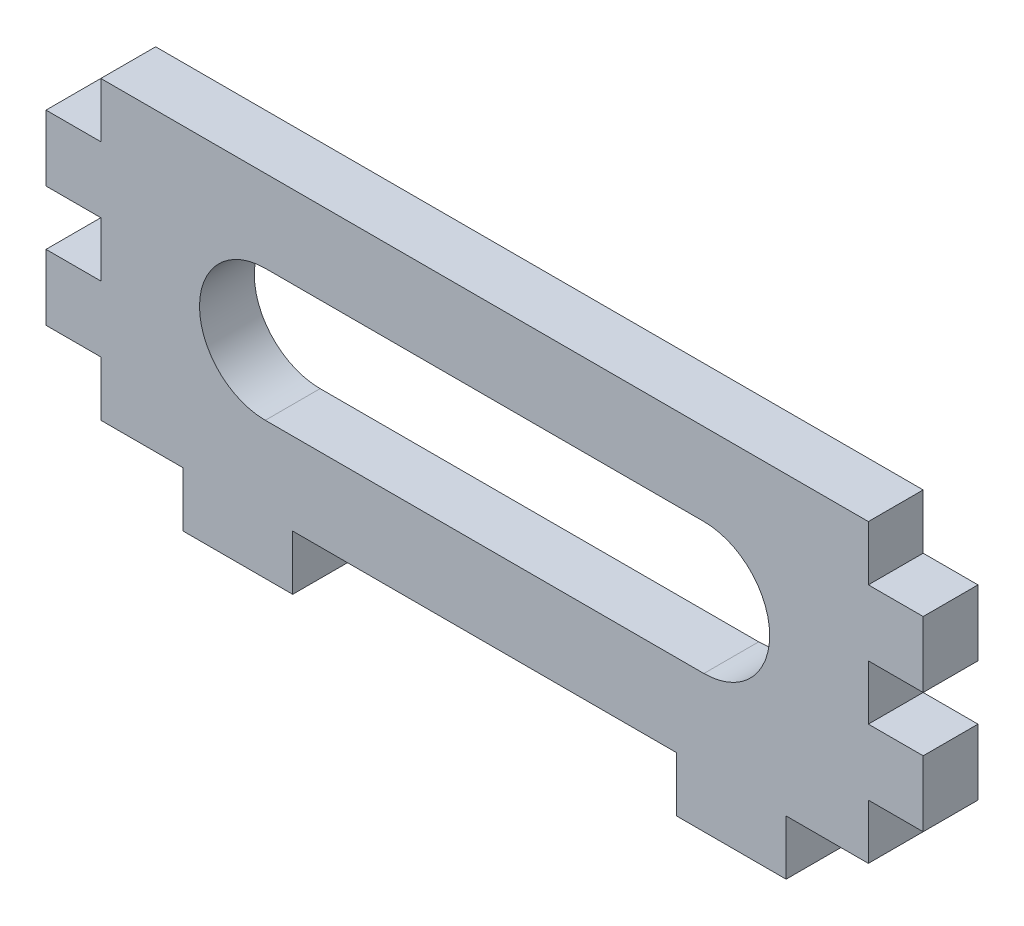
ISO-10303-21;
HEADER;
FILE_DESCRIPTION(('STEP AP214'),'2;1');
FILE_NAME('part.step','',(''),(''),'','','');
FILE_SCHEMA(('AUTOMOTIVE_DESIGN { 1 0 10303 214 1 1 1 1 }'));
ENDSEC;
DATA;
#1=APPLICATION_CONTEXT('core data for automotive mechanical design processes');
#2=APPLICATION_PROTOCOL_DEFINITION('international standard','automotive_design',2000,#1);
#3=PRODUCT_CONTEXT('',#1,'mechanical');
#4=PRODUCT('Part','Part','',(#3));
#5=PRODUCT_RELATED_PRODUCT_CATEGORY('part','',(#4));
#6=PRODUCT_DEFINITION_FORMATION('','',#4);
#7=PRODUCT_DEFINITION_CONTEXT('part definition',#1,'design');
#8=PRODUCT_DEFINITION('design','',#6,#7);
#9=PRODUCT_DEFINITION_SHAPE('','',#8);
#10=(LENGTH_UNIT() NAMED_UNIT(*) SI_UNIT(.MILLI.,.METRE.));
#11=(NAMED_UNIT(*) PLANE_ANGLE_UNIT() SI_UNIT($,.RADIAN.));
#12=(NAMED_UNIT(*) SI_UNIT($,.STERADIAN.) SOLID_ANGLE_UNIT());
#13=UNCERTAINTY_MEASURE_WITH_UNIT(LENGTH_MEASURE(1.E-05),#10,'distance_accuracy_value','');
#14=(GEOMETRIC_REPRESENTATION_CONTEXT(3) GLOBAL_UNCERTAINTY_ASSIGNED_CONTEXT((#13)) GLOBAL_UNIT_ASSIGNED_CONTEXT((#10,
#11,#12)) REPRESENTATION_CONTEXT('',''));
#15=CARTESIAN_POINT('',(0.,0.,0.));
#16=DIRECTION('',(0.,0.,1.));
#17=DIRECTION('',(1.,0.,0.));
#18=AXIS2_PLACEMENT_3D('',#15,#16,#17);
#19=CARTESIAN_POINT('',(-201.174614020416,143.421111622309,-5.));
#20=DIRECTION('',(0.,-1.,0.));
#21=DIRECTION('',(0.,0.,-1.));
#22=AXIS2_PLACEMENT_3D('',#19,#20,#21);
#23=PLANE('',#22);
#24=DIRECTION('',(0.,0.,1.));
#25=VECTOR('',#24,1.);
#26=CARTESIAN_POINT('',(-133.674614020416,143.421111622309,-5.));
#27=LINE('',#26,#25);
#28=CARTESIAN_POINT('',(-133.674614020416,143.421111622309,-5.));
#29=VERTEX_POINT('',#28);
#30=CARTESIAN_POINT('',(-133.674614020416,143.421111622309,0.));
#31=VERTEX_POINT('',#30);
#32=EDGE_CURVE('E520',#29,#31,#27,.T.);
#33=ORIENTED_EDGE('',*,*,#32,.F.);
#34=DIRECTION('',(1.,0.,0.));
#35=VECTOR('',#34,1.);
#36=CARTESIAN_POINT('',(-201.174614020416,143.421111622309,-5.));
#37=LINE('',#36,#35);
#38=CARTESIAN_POINT('',(-126.174614020416,143.421111622309,-5.));
#39=VERTEX_POINT('',#38);
#40=EDGE_CURVE('E37',#29,#39,#37,.T.);
#41=ORIENTED_EDGE('',*,*,#40,.T.);
#42=DIRECTION('',(0.,0.,1.));
#43=VECTOR('',#42,1.);
#44=CARTESIAN_POINT('',(-126.174614020416,143.421111622309,-5.));
#45=LINE('',#44,#43);
#46=CARTESIAN_POINT('',(-126.174614020416,143.421111622309,0.));
#47=VERTEX_POINT('',#46);
#48=EDGE_CURVE('E457',#39,#47,#45,.T.);
#49=ORIENTED_EDGE('',*,*,#48,.T.);
#50=DIRECTION('',(1.,0.,0.));
#51=VECTOR('',#50,1.);
#52=CARTESIAN_POINT('',(-201.174614020416,143.421111622309,0.));
#53=LINE('',#52,#51);
#54=EDGE_CURVE('E293',#31,#47,#53,.T.);
#55=ORIENTED_EDGE('',*,*,#54,.F.);
#56=EDGE_LOOP('',(#33,#41,#49,#55));
#57=FACE_BOUND('',#56,.T.);
#58=ADVANCED_FACE('F33',(#57),#23,.T.);
#59=CARTESIAN_POINT('',(-196.174614020416,143.421111622309,-5.));
#60=VERTEX_POINT('',#59);
#61=CARTESIAN_POINT('',(-188.674614020416,143.421111622309,-5.));
#62=VERTEX_POINT('',#61);
#63=EDGE_CURVE('E273',#60,#62,#37,.T.);
#64=ORIENTED_EDGE('',*,*,#63,.T.);
#65=DIRECTION('',(0.,0.,1.));
#66=VECTOR('',#65,1.);
#67=CARTESIAN_POINT('',(-188.674614020416,143.421111622309,-5.));
#68=LINE('',#67,#66);
#69=CARTESIAN_POINT('',(-188.674614020416,143.421111622309,0.));
#70=VERTEX_POINT('',#69);
#71=EDGE_CURVE('E318',#62,#70,#68,.T.);
#72=ORIENTED_EDGE('',*,*,#71,.T.);
#73=CARTESIAN_POINT('',(-196.174614020416,143.421111622309,0.));
#74=VERTEX_POINT('',#73);
#75=EDGE_CURVE('E281',#74,#70,#53,.T.);
#76=ORIENTED_EDGE('',*,*,#75,.F.);
#77=DIRECTION('',(0.,0.,1.));
#78=VECTOR('',#77,1.);
#79=CARTESIAN_POINT('',(-196.174614020416,143.421111622309,-5.));
#80=LINE('',#79,#78);
#81=EDGE_CURVE('E386',#60,#74,#80,.T.);
#82=ORIENTED_EDGE('',*,*,#81,.F.);
#83=EDGE_LOOP('',(#64,#72,#76,#82));
#84=FACE_BOUND('',#83,.T.);
#85=ADVANCED_FACE('F527',(#84),#23,.T.);
#86=CARTESIAN_POINT('',(-201.174614020416,170.421111622309,-5.));
#87=DIRECTION('',(-1.,0.,0.));
#88=DIRECTION('',(0.,0.,1.));
#89=AXIS2_PLACEMENT_3D('',#86,#87,#88);
#90=PLANE('',#89);
#91=DIRECTION('',(0.,0.,1.));
#92=VECTOR('',#91,1.);
#93=CARTESIAN_POINT('',(-201.174614020416,165.421111622309,-5.));
#94=LINE('',#93,#92);
#95=CARTESIAN_POINT('',(-201.174614020416,165.421111622309,-5.));
#96=VERTEX_POINT('',#95);
#97=CARTESIAN_POINT('',(-201.174614020416,165.421111622309,0.));
#98=VERTEX_POINT('',#97);
#99=EDGE_CURVE('E368',#96,#98,#94,.T.);
#100=ORIENTED_EDGE('',*,*,#99,.F.);
#101=DIRECTION('',(0.,-1.,0.));
#102=VECTOR('',#101,1.);
#103=CARTESIAN_POINT('',(-201.174614020416,170.421111622309,-5.));
#104=LINE('',#103,#102);
#105=CARTESIAN_POINT('',(-201.174614020416,159.421111622309,-5.));
#106=VERTEX_POINT('',#105);
#107=EDGE_CURVE('E278',#96,#106,#104,.T.);
#108=ORIENTED_EDGE('',*,*,#107,.T.);
#109=DIRECTION('',(0.,0.,1.));
#110=VECTOR('',#109,1.);
#111=CARTESIAN_POINT('',(-201.174614020416,159.421111622309,-5.));
#112=LINE('',#111,#110);
#113=CARTESIAN_POINT('',(-201.174614020416,159.421111622309,0.));
#114=VERTEX_POINT('',#113);
#115=EDGE_CURVE('E407',#106,#114,#112,.T.);
#116=ORIENTED_EDGE('',*,*,#115,.T.);
#117=DIRECTION('',(0.,-1.,0.));
#118=VECTOR('',#117,1.);
#119=CARTESIAN_POINT('',(-201.174614020416,170.421111622309,0.));
#120=LINE('',#119,#118);
#121=EDGE_CURVE('E292',#98,#114,#120,.T.);
#122=ORIENTED_EDGE('',*,*,#121,.F.);
#123=EDGE_LOOP('',(#100,#108,#116,#122));
#124=FACE_BOUND('',#123,.T.);
#125=ADVANCED_FACE('F564',(#124),#90,.T.);
#126=CARTESIAN_POINT('',(-121.174614020416,170.421111622309,-5.));
#127=DIRECTION('',(1.,0.,0.));
#128=DIRECTION('',(0.,0.,-1.));
#129=AXIS2_PLACEMENT_3D('',#126,#127,#128);
#130=PLANE('',#129);
#131=DIRECTION('',(0.,0.,1.));
#132=VECTOR('',#131,1.);
#133=CARTESIAN_POINT('',(-121.174614020416,159.421111622309,-5.));
#134=LINE('',#133,#132);
#135=CARTESIAN_POINT('',(-121.174614020416,159.421111622309,-5.));
#136=VERTEX_POINT('',#135);
#137=CARTESIAN_POINT('',(-121.174614020416,159.421111622309,0.));
#138=VERTEX_POINT('',#137);
#139=EDGE_CURVE('E443',#136,#138,#134,.T.);
#140=ORIENTED_EDGE('',*,*,#139,.F.);
#141=DIRECTION('',(0.,1.,0.));
#142=VECTOR('',#141,1.);
#143=CARTESIAN_POINT('',(-121.174614020416,170.421111622309,-5.));
#144=LINE('',#143,#142);
#145=CARTESIAN_POINT('',(-121.174614020416,165.421111622309,-5.));
#146=VERTEX_POINT('',#145);
#147=EDGE_CURVE('E276',#136,#146,#144,.T.);
#148=ORIENTED_EDGE('',*,*,#147,.T.);
#149=DIRECTION('',(0.,0.,1.));
#150=VECTOR('',#149,1.);
#151=CARTESIAN_POINT('',(-121.174614020416,165.421111622309,-5.));
#152=LINE('',#151,#150);
#153=CARTESIAN_POINT('',(-121.174614020416,165.421111622309,0.));
#154=VERTEX_POINT('',#153);
#155=EDGE_CURVE('E482',#146,#154,#152,.T.);
#156=ORIENTED_EDGE('',*,*,#155,.T.);
#157=DIRECTION('',(0.,1.,0.));
#158=VECTOR('',#157,1.);
#159=CARTESIAN_POINT('',(-121.174614020416,170.421111622309,0.));
#160=LINE('',#159,#158);
#161=EDGE_CURVE('E498',#138,#154,#160,.T.);
#162=ORIENTED_EDGE('',*,*,#161,.F.);
#163=EDGE_LOOP('',(#140,#148,#156,#162));
#164=FACE_BOUND('',#163,.T.);
#165=ADVANCED_FACE('F597',(#164),#130,.T.);
#166=DIRECTION('',(0.,0.,1.));
#167=VECTOR('',#166,1.);
#168=CARTESIAN_POINT('',(-201.174614020416,148.421111622309,-5.));
#169=LINE('',#168,#167);
#170=CARTESIAN_POINT('',(-201.174614020416,148.421111622309,-5.));
#171=VERTEX_POINT('',#170);
#172=CARTESIAN_POINT('',(-201.174614020416,148.421111622309,0.));
#173=VERTEX_POINT('',#172);
#174=EDGE_CURVE('E390',#171,#173,#169,.T.);
#175=ORIENTED_EDGE('',*,*,#174,.T.);
#176=CARTESIAN_POINT('',(-201.174614020416,154.421111622309,0.));
#177=VERTEX_POINT('',#176);
#178=EDGE_CURVE('E294',#177,#173,#120,.T.);
#179=ORIENTED_EDGE('',*,*,#178,.F.);
#180=DIRECTION('',(0.,0.,1.));
#181=VECTOR('',#180,1.);
#182=CARTESIAN_POINT('',(-201.174614020416,154.421111622309,-5.));
#183=LINE('',#182,#181);
#184=CARTESIAN_POINT('',(-201.174614020416,154.421111622309,-5.));
#185=VERTEX_POINT('',#184);
#186=EDGE_CURVE('E420',#185,#177,#183,.T.);
#187=ORIENTED_EDGE('',*,*,#186,.F.);
#188=EDGE_CURVE('E543',#185,#171,#104,.T.);
#189=ORIENTED_EDGE('',*,*,#188,.T.);
#190=EDGE_LOOP('',(#175,#179,#187,#189));
#191=FACE_BOUND('',#190,.T.);
#192=ADVANCED_FACE('F35',(#191),#90,.T.);
#193=CARTESIAN_POINT('',(-201.174614020416,170.421111622309,-5.));
#194=DIRECTION('',(0.,1.,0.));
#195=DIRECTION('',(0.,0.,1.));
#196=AXIS2_PLACEMENT_3D('',#193,#194,#195);
#197=PLANE('',#196);
#198=DIRECTION('',(0.,0.,1.));
#199=VECTOR('',#198,1.);
#200=CARTESIAN_POINT('',(-196.174614020416,170.421111622309,-5.));
#201=LINE('',#200,#199);
#202=CARTESIAN_POINT('',(-196.174614020416,170.421111622309,-5.));
#203=VERTEX_POINT('',#202);
#204=CARTESIAN_POINT('',(-196.174614020416,170.421111622309,0.));
#205=VERTEX_POINT('',#204);
#206=EDGE_CURVE('E372',#203,#205,#201,.T.);
#207=ORIENTED_EDGE('',*,*,#206,.T.);
#208=DIRECTION('',(-1.,0.,0.));
#209=VECTOR('',#208,1.);
#210=CARTESIAN_POINT('',(-201.174614020416,170.421111622309,0.));
#211=LINE('',#210,#209);
#212=CARTESIAN_POINT('',(-126.174614020416,170.421111622309,0.));
#213=VERTEX_POINT('',#212);
#214=EDGE_CURVE('E503',#213,#205,#211,.T.);
#215=ORIENTED_EDGE('',*,*,#214,.F.);
#216=DIRECTION('',(0.,0.,1.));
#217=VECTOR('',#216,1.);
#218=CARTESIAN_POINT('',(-126.174614020416,170.421111622309,-5.));
#219=LINE('',#218,#217);
#220=CARTESIAN_POINT('',(-126.174614020416,170.421111622309,-5.));
#221=VERTEX_POINT('',#220);
#222=EDGE_CURVE('E480',#221,#213,#219,.T.);
#223=ORIENTED_EDGE('',*,*,#222,.F.);
#224=DIRECTION('',(-1.,0.,0.));
#225=VECTOR('',#224,1.);
#226=CARTESIAN_POINT('',(-201.174614020416,170.421111622309,-5.));
#227=LINE('',#226,#225);
#228=EDGE_CURVE('E11',#221,#203,#227,.T.);
#229=ORIENTED_EDGE('',*,*,#228,.T.);
#230=EDGE_LOOP('',(#207,#215,#223,#229));
#231=FACE_BOUND('',#230,.T.);
#232=ADVANCED_FACE('F553',(#231),#197,.T.);
#233=DIRECTION('',(0.,0.,1.));
#234=VECTOR('',#233,1.);
#235=CARTESIAN_POINT('',(-121.174614020416,154.421111622309,-5.));
#236=LINE('',#235,#234);
#237=CARTESIAN_POINT('',(-121.174614020416,154.421111622309,-5.));
#238=VERTEX_POINT('',#237);
#239=CARTESIAN_POINT('',(-121.174614020416,154.421111622309,0.));
#240=VERTEX_POINT('',#239);
#241=EDGE_CURVE('E445',#238,#240,#236,.T.);
#242=ORIENTED_EDGE('',*,*,#241,.T.);
#243=CARTESIAN_POINT('',(-121.174614020416,148.421111622309,0.));
#244=VERTEX_POINT('',#243);
#245=EDGE_CURVE('E297',#244,#240,#160,.T.);
#246=ORIENTED_EDGE('',*,*,#245,.F.);
#247=DIRECTION('',(0.,0.,1.));
#248=VECTOR('',#247,1.);
#249=CARTESIAN_POINT('',(-121.174614020416,148.421111622309,-5.));
#250=LINE('',#249,#248);
#251=CARTESIAN_POINT('',(-121.174614020416,148.421111622309,-5.));
#252=VERTEX_POINT('',#251);
#253=EDGE_CURVE('E465',#252,#244,#250,.T.);
#254=ORIENTED_EDGE('',*,*,#253,.F.);
#255=EDGE_CURVE('E43',#252,#238,#144,.T.);
#256=ORIENTED_EDGE('',*,*,#255,.T.);
#257=EDGE_LOOP('',(#242,#246,#254,#256));
#258=FACE_BOUND('',#257,.T.);
#259=ADVANCED_FACE('F589',(#258),#130,.T.);
#260=DIRECTION('',(0.,0.,1.));
#261=VECTOR('',#260,1.);
#262=CARTESIAN_POINT('',(-143.674614020416,143.421111622309,-5.));
#263=LINE('',#262,#261);
#264=CARTESIAN_POINT('',(-143.674614020416,143.421111622309,-5.));
#265=VERTEX_POINT('',#264);
#266=CARTESIAN_POINT('',(-143.674614020416,143.421111622309,0.));
#267=VERTEX_POINT('',#266);
#268=EDGE_CURVE('E246',#265,#267,#263,.T.);
#269=ORIENTED_EDGE('',*,*,#268,.T.);
#270=CARTESIAN_POINT('',(-178.674614020416,143.421111622309,0.));
#271=VERTEX_POINT('',#270);
#272=EDGE_CURVE('E300',#271,#267,#53,.T.);
#273=ORIENTED_EDGE('',*,*,#272,.F.);
#274=DIRECTION('',(0.,0.,1.));
#275=VECTOR('',#274,1.);
#276=CARTESIAN_POINT('',(-178.674614020416,143.421111622309,-5.));
#277=LINE('',#276,#275);
#278=CARTESIAN_POINT('',(-178.674614020416,143.421111622309,-5.));
#279=VERTEX_POINT('',#278);
#280=EDGE_CURVE('E272',#279,#271,#277,.T.);
#281=ORIENTED_EDGE('',*,*,#280,.F.);
#282=EDGE_CURVE('E265',#279,#265,#37,.T.);
#283=ORIENTED_EDGE('',*,*,#282,.T.);
#284=EDGE_LOOP('',(#269,#273,#281,#283));
#285=FACE_BOUND('',#284,.T.);
#286=ADVANCED_FACE('F271',(#285),#23,.T.);
#287=CARTESIAN_POINT('',(0.,0.,-5.));
#288=DIRECTION('',(0.,0.,1.));
#289=DIRECTION('',(1.,0.,0.));
#290=AXIS2_PLACEMENT_3D('',#287,#288,#289);
#291=PLANE('',#290);
#292=DIRECTION('',(-1.,0.,0.));
#293=VECTOR('',#292,1.);
#294=CARTESIAN_POINT('',(-181.174614020416,162.921111622309,-5.));
#295=LINE('',#294,#293);
#296=CARTESIAN_POINT('',(-141.174614020416,162.921111622309,-5.));
#297=VERTEX_POINT('',#296);
#298=CARTESIAN_POINT('',(-181.174614020416,162.921111622309,-5.));
#299=VERTEX_POINT('',#298);
#300=EDGE_CURVE('E339',#297,#299,#295,.T.);
#301=ORIENTED_EDGE('',*,*,#300,.T.);
#302=CARTESIAN_POINT('',(-181.174614020416,156.921111622309,-5.));
#303=DIRECTION('',(0.,0.,1.));
#304=DIRECTION('',(1.,0.,0.));
#305=AXIS2_PLACEMENT_3D('',#302,#303,#304);
#306=CIRCLE('',#305,6.00000000000003);
#307=CARTESIAN_POINT('',(-181.174614020416,150.921111622309,-5.));
#308=VERTEX_POINT('',#307);
#309=EDGE_CURVE('E329',#299,#308,#306,.T.);
#310=ORIENTED_EDGE('',*,*,#309,.T.);
#311=DIRECTION('',(1.,0.,0.));
#312=VECTOR('',#311,1.);
#313=CARTESIAN_POINT('',(-181.174614020416,150.921111622309,-5.));
#314=LINE('',#313,#312);
#315=CARTESIAN_POINT('',(-141.174614020416,150.921111622309,-5.));
#316=VERTEX_POINT('',#315);
#317=EDGE_CURVE('E332',#308,#316,#314,.T.);
#318=ORIENTED_EDGE('',*,*,#317,.T.);
#319=CARTESIAN_POINT('',(-141.174614020416,156.921111622309,-5.));
#320=DIRECTION('',(0.,0.,1.));
#321=DIRECTION('',(1.,0.,0.));
#322=AXIS2_PLACEMENT_3D('',#319,#320,#321);
#323=CIRCLE('',#322,6.00000000000003);
#324=EDGE_CURVE('E336',#316,#297,#323,.T.);
#325=ORIENTED_EDGE('',*,*,#324,.T.);
#326=EDGE_LOOP('',(#301,#310,#318,#325));
#327=FACE_BOUND('',#326,.T.);
#328=DIRECTION('',(1.,0.,0.));
#329=VECTOR('',#328,1.);
#330=CARTESIAN_POINT('',(-196.174614020416,165.421111622309,-5.));
#331=LINE('',#330,#329);
#332=CARTESIAN_POINT('',(-196.174614020416,165.421111622309,-5.));
#333=VERTEX_POINT('',#332);
#334=EDGE_CURVE('E362',#96,#333,#331,.T.);
#335=ORIENTED_EDGE('',*,*,#334,.T.);
#336=DIRECTION('',(0.,1.,0.));
#337=VECTOR('',#336,1.);
#338=CARTESIAN_POINT('',(-196.174614020416,170.421111622309,-5.));
#339=LINE('',#338,#337);
#340=EDGE_CURVE('E364',#333,#203,#339,.T.);
#341=ORIENTED_EDGE('',*,*,#340,.T.);
#342=ORIENTED_EDGE('',*,*,#228,.F.);
#343=DIRECTION('',(0.,-1.,0.));
#344=VECTOR('',#343,1.);
#345=CARTESIAN_POINT('',(-126.174614020416,170.421111622309,-5.));
#346=LINE('',#345,#344);
#347=CARTESIAN_POINT('',(-126.174614020416,165.421111622309,-5.));
#348=VERTEX_POINT('',#347);
#349=EDGE_CURVE('E469',#221,#348,#346,.T.);
#350=ORIENTED_EDGE('',*,*,#349,.T.);
#351=DIRECTION('',(1.,0.,0.));
#352=VECTOR('',#351,1.);
#353=CARTESIAN_POINT('',(-126.174614020416,165.421111622309,-5.));
#354=LINE('',#353,#352);
#355=EDGE_CURVE('E472',#348,#146,#354,.T.);
#356=ORIENTED_EDGE('',*,*,#355,.T.);
#357=ORIENTED_EDGE('',*,*,#147,.F.);
#358=DIRECTION('',(-1.,0.,0.));
#359=VECTOR('',#358,1.);
#360=CARTESIAN_POINT('',(-126.174614020416,159.421111622309,-5.));
#361=LINE('',#360,#359);
#362=CARTESIAN_POINT('',(-126.174614020416,159.421111622309,-5.));
#363=VERTEX_POINT('',#362);
#364=EDGE_CURVE('E431',#136,#363,#361,.T.);
#365=ORIENTED_EDGE('',*,*,#364,.T.);
#366=DIRECTION('',(0.,-1.,0.));
#367=VECTOR('',#366,1.);
#368=CARTESIAN_POINT('',(-126.174614020416,159.421111622309,-5.));
#369=LINE('',#368,#367);
#370=CARTESIAN_POINT('',(-126.174614020416,154.421111622309,-5.));
#371=VERTEX_POINT('',#370);
#372=EDGE_CURVE('E424',#363,#371,#369,.T.);
#373=ORIENTED_EDGE('',*,*,#372,.T.);
#374=DIRECTION('',(1.,0.,0.));
#375=VECTOR('',#374,1.);
#376=CARTESIAN_POINT('',(-126.174614020416,154.421111622309,-5.));
#377=LINE('',#376,#375);
#378=EDGE_CURVE('E427',#371,#238,#377,.T.);
#379=ORIENTED_EDGE('',*,*,#378,.T.);
#380=ORIENTED_EDGE('',*,*,#255,.F.);
#381=DIRECTION('',(-1.,0.,0.));
#382=VECTOR('',#381,1.);
#383=CARTESIAN_POINT('',(-126.174614020416,148.421111622309,-5.));
#384=LINE('',#383,#382);
#385=CARTESIAN_POINT('',(-126.174614020416,148.421111622309,-5.));
#386=VERTEX_POINT('',#385);
#387=EDGE_CURVE('E453',#252,#386,#384,.T.);
#388=ORIENTED_EDGE('',*,*,#387,.T.);
#389=DIRECTION('',(0.,-1.,0.));
#390=VECTOR('',#389,1.);
#391=CARTESIAN_POINT('',(-126.174614020416,143.421111622309,-5.));
#392=LINE('',#391,#390);
#393=EDGE_CURVE('E450',#386,#39,#392,.T.);
#394=ORIENTED_EDGE('',*,*,#393,.T.);
#395=ORIENTED_EDGE('',*,*,#40,.F.);
#396=DIRECTION('',(0.,1.,0.));
#397=VECTOR('',#396,1.);
#398=CARTESIAN_POINT('',(-133.674614020416,143.421111622309,-5.));
#399=LINE('',#398,#397);
#400=CARTESIAN_POINT('',(-133.674614020416,138.421111622309,-5.));
#401=VERTEX_POINT('',#400);
#402=EDGE_CURVE('E257',#401,#29,#399,.T.);
#403=ORIENTED_EDGE('',*,*,#402,.F.);
#404=DIRECTION('',(1.,0.,0.));
#405=VECTOR('',#404,1.);
#406=CARTESIAN_POINT('',(-133.674614020416,138.421111622309,-5.));
#407=LINE('',#406,#405);
#408=CARTESIAN_POINT('',(-143.674614020416,138.421111622309,-5.));
#409=VERTEX_POINT('',#408);
#410=EDGE_CURVE('E268',#409,#401,#407,.T.);
#411=ORIENTED_EDGE('',*,*,#410,.F.);
#412=DIRECTION('',(0.,-1.,0.));
#413=VECTOR('',#412,1.);
#414=CARTESIAN_POINT('',(-143.674614020416,143.421111622309,-5.));
#415=LINE('',#414,#413);
#416=EDGE_CURVE('E249',#265,#409,#415,.T.);
#417=ORIENTED_EDGE('',*,*,#416,.F.);
#418=ORIENTED_EDGE('',*,*,#282,.F.);
#419=DIRECTION('',(0.,1.,0.));
#420=VECTOR('',#419,1.);
#421=CARTESIAN_POINT('',(-178.674614020416,143.421111622309,-5.));
#422=LINE('',#421,#420);
#423=CARTESIAN_POINT('',(-178.674614020416,138.421111622309,-5.));
#424=VERTEX_POINT('',#423);
#425=EDGE_CURVE('E312',#424,#279,#422,.T.);
#426=ORIENTED_EDGE('',*,*,#425,.F.);
#427=DIRECTION('',(1.,0.,0.));
#428=VECTOR('',#427,1.);
#429=CARTESIAN_POINT('',(-188.674614020416,138.421111622309,-5.));
#430=LINE('',#429,#428);
#431=CARTESIAN_POINT('',(-188.674614020416,138.421111622309,-5.));
#432=VERTEX_POINT('',#431);
#433=EDGE_CURVE('E315',#432,#424,#430,.T.);
#434=ORIENTED_EDGE('',*,*,#433,.F.);
#435=DIRECTION('',(0.,-1.,0.));
#436=VECTOR('',#435,1.);
#437=CARTESIAN_POINT('',(-188.674614020416,143.421111622309,-5.));
#438=LINE('',#437,#436);
#439=EDGE_CURVE('E308',#62,#432,#438,.T.);
#440=ORIENTED_EDGE('',*,*,#439,.F.);
#441=ORIENTED_EDGE('',*,*,#63,.F.);
#442=DIRECTION('',(0.,1.,0.));
#443=VECTOR('',#442,1.);
#444=CARTESIAN_POINT('',(-196.174614020416,143.421111622309,-5.));
#445=LINE('',#444,#443);
#446=CARTESIAN_POINT('',(-196.174614020416,148.421111622309,-5.));
#447=VERTEX_POINT('',#446);
#448=EDGE_CURVE('E379',#60,#447,#445,.T.);
#449=ORIENTED_EDGE('',*,*,#448,.T.);
#450=DIRECTION('',(-1.,0.,0.));
#451=VECTOR('',#450,1.);
#452=CARTESIAN_POINT('',(-196.174614020416,148.421111622309,-5.));
#453=LINE('',#452,#451);
#454=EDGE_CURVE('E382',#447,#171,#453,.T.);
#455=ORIENTED_EDGE('',*,*,#454,.T.);
#456=ORIENTED_EDGE('',*,*,#188,.F.);
#457=DIRECTION('',(1.,0.,0.));
#458=VECTOR('',#457,1.);
#459=CARTESIAN_POINT('',(-196.174614020416,154.421111622309,-5.));
#460=LINE('',#459,#458);
#461=CARTESIAN_POINT('',(-196.174614020416,154.421111622309,-5.));
#462=VERTEX_POINT('',#461);
#463=EDGE_CURVE('E400',#185,#462,#460,.T.);
#464=ORIENTED_EDGE('',*,*,#463,.T.);
#465=DIRECTION('',(0.,1.,0.));
#466=VECTOR('',#465,1.);
#467=CARTESIAN_POINT('',(-196.174614020416,159.421111622309,-5.));
#468=LINE('',#467,#466);
#469=CARTESIAN_POINT('',(-196.174614020416,159.421111622309,-5.));
#470=VERTEX_POINT('',#469);
#471=EDGE_CURVE('E404',#462,#470,#468,.T.);
#472=ORIENTED_EDGE('',*,*,#471,.T.);
#473=DIRECTION('',(-1.,0.,0.));
#474=VECTOR('',#473,1.);
#475=CARTESIAN_POINT('',(-196.174614020416,159.421111622309,-5.));
#476=LINE('',#475,#474);
#477=EDGE_CURVE('E397',#470,#106,#476,.T.);
#478=ORIENTED_EDGE('',*,*,#477,.T.);
#479=ORIENTED_EDGE('',*,*,#107,.F.);
#480=EDGE_LOOP('',(#335,#341,#342,#350,#356,#357,#365,#373,#379,#380,#388,#394,#395,#403,#411,
#417,#418,#426,#434,#440,#441,#449,#455,#456,#464,#472,#478,#479));
#481=FACE_BOUND('',#480,.T.);
#482=ADVANCED_FACE('F263',(#327,#481),#291,.F.);
#483=CARTESIAN_POINT('',(0.,0.,0.));
#484=DIRECTION('',(0.,0.,1.));
#485=DIRECTION('',(1.,0.,0.));
#486=AXIS2_PLACEMENT_3D('',#483,#484,#485);
#487=PLANE('',#486);
#488=CARTESIAN_POINT('',(-181.174614020416,156.921111622309,0.));
#489=DIRECTION('',(0.,0.,1.));
#490=DIRECTION('',(1.,0.,0.));
#491=AXIS2_PLACEMENT_3D('',#488,#489,#490);
#492=CIRCLE('',#491,6.00000000000003);
#493=CARTESIAN_POINT('',(-181.174614020416,162.921111622309,0.));
#494=VERTEX_POINT('',#493);
#495=CARTESIAN_POINT('',(-181.174614020416,150.921111622309,0.));
#496=VERTEX_POINT('',#495);
#497=EDGE_CURVE('E343',#494,#496,#492,.T.);
#498=ORIENTED_EDGE('',*,*,#497,.F.);
#499=DIRECTION('',(-1.,0.,0.));
#500=VECTOR('',#499,1.);
#501=CARTESIAN_POINT('',(-181.174614020416,162.921111622309,0.));
#502=LINE('',#501,#500);
#503=CARTESIAN_POINT('',(-141.174614020416,162.921111622309,0.));
#504=VERTEX_POINT('',#503);
#505=EDGE_CURVE('E333',#504,#494,#502,.T.);
#506=ORIENTED_EDGE('',*,*,#505,.F.);
#507=CARTESIAN_POINT('',(-141.174614020416,156.921111622309,0.));
#508=DIRECTION('',(0.,0.,1.));
#509=DIRECTION('',(1.,0.,0.));
#510=AXIS2_PLACEMENT_3D('',#507,#508,#509);
#511=CIRCLE('',#510,6.00000000000003);
#512=CARTESIAN_POINT('',(-141.174614020416,150.921111622309,0.));
#513=VERTEX_POINT('',#512);
#514=EDGE_CURVE('E348',#513,#504,#511,.T.);
#515=ORIENTED_EDGE('',*,*,#514,.F.);
#516=DIRECTION('',(1.,0.,0.));
#517=VECTOR('',#516,1.);
#518=CARTESIAN_POINT('',(-181.174614020416,150.921111622309,0.));
#519=LINE('',#518,#517);
#520=EDGE_CURVE('E345',#496,#513,#519,.T.);
#521=ORIENTED_EDGE('',*,*,#520,.F.);
#522=EDGE_LOOP('',(#498,#506,#515,#521));
#523=FACE_BOUND('',#522,.T.);
#524=DIRECTION('',(0.,1.,0.));
#525=VECTOR('',#524,1.);
#526=CARTESIAN_POINT('',(-196.174614020416,170.421111622309,0.));
#527=LINE('',#526,#525);
#528=CARTESIAN_POINT('',(-196.174614020416,165.421111622309,0.));
#529=VERTEX_POINT('',#528);
#530=EDGE_CURVE('E365',#529,#205,#527,.T.);
#531=ORIENTED_EDGE('',*,*,#530,.F.);
#532=DIRECTION('',(1.,0.,0.));
#533=VECTOR('',#532,1.);
#534=CARTESIAN_POINT('',(-196.174614020416,165.421111622309,0.));
#535=LINE('',#534,#533);
#536=EDGE_CURVE('E355',#98,#529,#535,.T.);
#537=ORIENTED_EDGE('',*,*,#536,.F.);
#538=ORIENTED_EDGE('',*,*,#121,.T.);
#539=DIRECTION('',(-1.,0.,0.));
#540=VECTOR('',#539,1.);
#541=CARTESIAN_POINT('',(-196.174614020416,159.421111622309,0.));
#542=LINE('',#541,#540);
#543=CARTESIAN_POINT('',(-196.174614020416,159.421111622309,0.));
#544=VERTEX_POINT('',#543);
#545=EDGE_CURVE('E393',#544,#114,#542,.T.);
#546=ORIENTED_EDGE('',*,*,#545,.F.);
#547=DIRECTION('',(0.,1.,0.));
#548=VECTOR('',#547,1.);
#549=CARTESIAN_POINT('',(-196.174614020416,159.421111622309,0.));
#550=LINE('',#549,#548);
#551=CARTESIAN_POINT('',(-196.174614020416,154.421111622309,0.));
#552=VERTEX_POINT('',#551);
#553=EDGE_CURVE('E401',#552,#544,#550,.T.);
#554=ORIENTED_EDGE('',*,*,#553,.F.);
#555=DIRECTION('',(1.,0.,0.));
#556=VECTOR('',#555,1.);
#557=CARTESIAN_POINT('',(-196.174614020416,154.421111622309,0.));
#558=LINE('',#557,#556);
#559=EDGE_CURVE('E410',#177,#552,#558,.T.);
#560=ORIENTED_EDGE('',*,*,#559,.F.);
#561=ORIENTED_EDGE('',*,*,#178,.T.);
#562=DIRECTION('',(-1.,0.,0.));
#563=VECTOR('',#562,1.);
#564=CARTESIAN_POINT('',(-196.174614020416,148.421111622309,0.));
#565=LINE('',#564,#563);
#566=CARTESIAN_POINT('',(-196.174614020416,148.421111622309,0.));
#567=VERTEX_POINT('',#566);
#568=EDGE_CURVE('E383',#567,#173,#565,.T.);
#569=ORIENTED_EDGE('',*,*,#568,.F.);
#570=DIRECTION('',(0.,1.,0.));
#571=VECTOR('',#570,1.);
#572=CARTESIAN_POINT('',(-196.174614020416,143.421111622309,0.));
#573=LINE('',#572,#571);
#574=EDGE_CURVE('E375',#74,#567,#573,.T.);
#575=ORIENTED_EDGE('',*,*,#574,.F.);
#576=ORIENTED_EDGE('',*,*,#75,.T.);
#577=DIRECTION('',(0.,-1.,0.));
#578=VECTOR('',#577,1.);
#579=CARTESIAN_POINT('',(-188.674614020416,143.421111622309,0.));
#580=LINE('',#579,#578);
#581=CARTESIAN_POINT('',(-188.674614020416,138.421111622309,0.));
#582=VERTEX_POINT('',#581);
#583=EDGE_CURVE('E59',#70,#582,#580,.T.);
#584=ORIENTED_EDGE('',*,*,#583,.T.);
#585=DIRECTION('',(1.,0.,0.));
#586=VECTOR('',#585,1.);
#587=CARTESIAN_POINT('',(-188.674614020416,138.421111622309,0.));
#588=LINE('',#587,#586);
#589=CARTESIAN_POINT('',(-178.674614020416,138.421111622309,0.));
#590=VERTEX_POINT('',#589);
#591=EDGE_CURVE('E309',#582,#590,#588,.T.);
#592=ORIENTED_EDGE('',*,*,#591,.T.);
#593=DIRECTION('',(0.,1.,0.));
#594=VECTOR('',#593,1.);
#595=CARTESIAN_POINT('',(-178.674614020416,143.421111622309,0.));
#596=LINE('',#595,#594);
#597=EDGE_CURVE('E305',#590,#271,#596,.T.);
#598=ORIENTED_EDGE('',*,*,#597,.T.);
#599=ORIENTED_EDGE('',*,*,#272,.T.);
#600=DIRECTION('',(0.,-1.,0.));
#601=VECTOR('',#600,1.);
#602=CARTESIAN_POINT('',(-143.674614020416,143.421111622309,0.));
#603=LINE('',#602,#601);
#604=CARTESIAN_POINT('',(-143.674614020416,138.421111622309,0.));
#605=VERTEX_POINT('',#604);
#606=EDGE_CURVE('E251',#267,#605,#603,.T.);
#607=ORIENTED_EDGE('',*,*,#606,.T.);
#608=DIRECTION('',(1.,0.,0.));
#609=VECTOR('',#608,1.);
#610=CARTESIAN_POINT('',(-133.674614020416,138.421111622309,0.));
#611=LINE('',#610,#609);
#612=CARTESIAN_POINT('',(-133.674614020416,138.421111622309,0.));
#613=VERTEX_POINT('',#612);
#614=EDGE_CURVE('E656',#605,#613,#611,.T.);
#615=ORIENTED_EDGE('',*,*,#614,.T.);
#616=DIRECTION('',(0.,1.,0.));
#617=VECTOR('',#616,1.);
#618=CARTESIAN_POINT('',(-133.674614020416,143.421111622309,0.));
#619=LINE('',#618,#617);
#620=EDGE_CURVE('E51',#613,#31,#619,.T.);
#621=ORIENTED_EDGE('',*,*,#620,.T.);
#622=ORIENTED_EDGE('',*,*,#54,.T.);
#623=DIRECTION('',(0.,-1.,0.));
#624=VECTOR('',#623,1.);
#625=CARTESIAN_POINT('',(-126.174614020416,143.421111622309,0.));
#626=LINE('',#625,#624);
#627=CARTESIAN_POINT('',(-126.174614020416,148.421111622309,0.));
#628=VERTEX_POINT('',#627);
#629=EDGE_CURVE('E442',#628,#47,#626,.T.);
#630=ORIENTED_EDGE('',*,*,#629,.F.);
#631=DIRECTION('',(-1.,0.,0.));
#632=VECTOR('',#631,1.);
#633=CARTESIAN_POINT('',(-126.174614020416,148.421111622309,0.));
#634=LINE('',#633,#632);
#635=EDGE_CURVE('E454',#244,#628,#634,.T.);
#636=ORIENTED_EDGE('',*,*,#635,.F.);
#637=ORIENTED_EDGE('',*,*,#245,.T.);
#638=DIRECTION('',(1.,0.,0.));
#639=VECTOR('',#638,1.);
#640=CARTESIAN_POINT('',(-126.174614020416,154.421111622309,0.));
#641=LINE('',#640,#639);
#642=CARTESIAN_POINT('',(-126.174614020416,154.421111622309,0.));
#643=VERTEX_POINT('',#642);
#644=EDGE_CURVE('E436',#643,#240,#641,.T.);
#645=ORIENTED_EDGE('',*,*,#644,.F.);
#646=DIRECTION('',(0.,-1.,0.));
#647=VECTOR('',#646,1.);
#648=CARTESIAN_POINT('',(-126.174614020416,159.421111622309,0.));
#649=LINE('',#648,#647);
#650=CARTESIAN_POINT('',(-126.174614020416,159.421111622309,0.));
#651=VERTEX_POINT('',#650);
#652=EDGE_CURVE('E417',#651,#643,#649,.T.);
#653=ORIENTED_EDGE('',*,*,#652,.F.);
#654=DIRECTION('',(-1.,0.,0.));
#655=VECTOR('',#654,1.);
#656=CARTESIAN_POINT('',(-126.174614020416,159.421111622309,0.));
#657=LINE('',#656,#655);
#658=EDGE_CURVE('E428',#138,#651,#657,.T.);
#659=ORIENTED_EDGE('',*,*,#658,.F.);
#660=ORIENTED_EDGE('',*,*,#161,.T.);
#661=DIRECTION('',(1.,0.,0.));
#662=VECTOR('',#661,1.);
#663=CARTESIAN_POINT('',(-126.174614020416,165.421111622309,0.));
#664=LINE('',#663,#662);
#665=CARTESIAN_POINT('',(-126.174614020416,165.421111622309,0.));
#666=VERTEX_POINT('',#665);
#667=EDGE_CURVE('E473',#666,#154,#664,.T.);
#668=ORIENTED_EDGE('',*,*,#667,.F.);
#669=DIRECTION('',(0.,-1.,0.));
#670=VECTOR('',#669,1.);
#671=CARTESIAN_POINT('',(-126.174614020416,170.421111622309,0.));
#672=LINE('',#671,#670);
#673=EDGE_CURVE('E464',#213,#666,#672,.T.);
#674=ORIENTED_EDGE('',*,*,#673,.F.);
#675=ORIENTED_EDGE('',*,*,#214,.T.);
#676=EDGE_LOOP('',(#531,#537,#538,#546,#554,#560,#561,#569,#575,#576,#584,#592,#598,#599,#607,
#615,#621,#622,#630,#636,#637,#645,#653,#659,#660,#668,#674,#675));
#677=FACE_BOUND('',#676,.T.);
#678=ADVANCED_FACE('F493',(#523,#677),#487,.T.);
#679=CARTESIAN_POINT('',(-126.174614020416,170.421111622309,-5.));
#680=DIRECTION('',(-1.,0.,0.));
#681=DIRECTION('',(0.,0.,1.));
#682=AXIS2_PLACEMENT_3D('',#679,#680,#681);
#683=PLANE('',#682);
#684=ORIENTED_EDGE('',*,*,#673,.T.);
#685=DIRECTION('',(0.,0.,1.));
#686=VECTOR('',#685,1.);
#687=CARTESIAN_POINT('',(-126.174614020416,165.421111622309,-5.));
#688=LINE('',#687,#686);
#689=EDGE_CURVE('E476',#348,#666,#688,.T.);
#690=ORIENTED_EDGE('',*,*,#689,.F.);
#691=ORIENTED_EDGE('',*,*,#349,.F.);
#692=ORIENTED_EDGE('',*,*,#222,.T.);
#693=EDGE_LOOP('',(#684,#690,#691,#692));
#694=FACE_BOUND('',#693,.T.);
#695=ADVANCED_FACE('F609',(#694),#683,.F.);
#696=CARTESIAN_POINT('',(-126.174614020416,165.421111622309,-5.));
#697=DIRECTION('',(0.,-1.,0.));
#698=DIRECTION('',(0.,0.,-1.));
#699=AXIS2_PLACEMENT_3D('',#696,#697,#698);
#700=PLANE('',#699);
#701=ORIENTED_EDGE('',*,*,#667,.T.);
#702=ORIENTED_EDGE('',*,*,#155,.F.);
#703=ORIENTED_EDGE('',*,*,#355,.F.);
#704=ORIENTED_EDGE('',*,*,#689,.T.);
#705=EDGE_LOOP('',(#701,#702,#703,#704));
#706=FACE_BOUND('',#705,.T.);
#707=ADVANCED_FACE('F488',(#706),#700,.F.);
#708=CARTESIAN_POINT('',(-126.174614020416,143.421111622309,-5.));
#709=DIRECTION('',(-1.,0.,0.));
#710=DIRECTION('',(0.,0.,1.));
#711=AXIS2_PLACEMENT_3D('',#708,#709,#710);
#712=PLANE('',#711);
#713=ORIENTED_EDGE('',*,*,#629,.T.);
#714=ORIENTED_EDGE('',*,*,#48,.F.);
#715=ORIENTED_EDGE('',*,*,#393,.F.);
#716=DIRECTION('',(0.,0.,1.));
#717=VECTOR('',#716,1.);
#718=CARTESIAN_POINT('',(-126.174614020416,148.421111622309,-5.));
#719=LINE('',#718,#717);
#720=EDGE_CURVE('E462',#386,#628,#719,.T.);
#721=ORIENTED_EDGE('',*,*,#720,.T.);
#722=EDGE_LOOP('',(#713,#714,#715,#721));
#723=FACE_BOUND('',#722,.T.);
#724=ADVANCED_FACE('F616',(#723),#712,.F.);
#725=CARTESIAN_POINT('',(-126.174614020416,148.421111622309,-5.));
#726=DIRECTION('',(0.,1.,0.));
#727=DIRECTION('',(0.,0.,1.));
#728=AXIS2_PLACEMENT_3D('',#725,#726,#727);
#729=PLANE('',#728);
#730=ORIENTED_EDGE('',*,*,#635,.T.);
#731=ORIENTED_EDGE('',*,*,#720,.F.);
#732=ORIENTED_EDGE('',*,*,#387,.F.);
#733=ORIENTED_EDGE('',*,*,#253,.T.);
#734=EDGE_LOOP('',(#730,#731,#732,#733));
#735=FACE_BOUND('',#734,.T.);
#736=ADVANCED_FACE('F623',(#735),#729,.F.);
#737=CARTESIAN_POINT('',(-126.174614020416,159.421111622309,-5.));
#738=DIRECTION('',(-1.,0.,0.));
#739=DIRECTION('',(0.,0.,1.));
#740=AXIS2_PLACEMENT_3D('',#737,#738,#739);
#741=PLANE('',#740);
#742=ORIENTED_EDGE('',*,*,#652,.T.);
#743=DIRECTION('',(0.,0.,1.));
#744=VECTOR('',#743,1.);
#745=CARTESIAN_POINT('',(-126.174614020416,154.421111622309,-5.));
#746=LINE('',#745,#744);
#747=EDGE_CURVE('E434',#371,#643,#746,.T.);
#748=ORIENTED_EDGE('',*,*,#747,.F.);
#749=ORIENTED_EDGE('',*,*,#372,.F.);
#750=DIRECTION('',(0.,0.,1.));
#751=VECTOR('',#750,1.);
#752=CARTESIAN_POINT('',(-126.174614020416,159.421111622309,-5.));
#753=LINE('',#752,#751);
#754=EDGE_CURVE('E440',#363,#651,#753,.T.);
#755=ORIENTED_EDGE('',*,*,#754,.T.);
#756=EDGE_LOOP('',(#742,#748,#749,#755));
#757=FACE_BOUND('',#756,.T.);
#758=ADVANCED_FACE('F627',(#757),#741,.F.);
#759=CARTESIAN_POINT('',(-126.174614020416,159.421111622309,-5.));
#760=DIRECTION('',(0.,1.,0.));
#761=DIRECTION('',(0.,0.,1.));
#762=AXIS2_PLACEMENT_3D('',#759,#760,#761);
#763=PLANE('',#762);
#764=ORIENTED_EDGE('',*,*,#658,.T.);
#765=ORIENTED_EDGE('',*,*,#754,.F.);
#766=ORIENTED_EDGE('',*,*,#364,.F.);
#767=ORIENTED_EDGE('',*,*,#139,.T.);
#768=EDGE_LOOP('',(#764,#765,#766,#767));
#769=FACE_BOUND('',#768,.T.);
#770=ADVANCED_FACE('F631',(#769),#763,.F.);
#771=CARTESIAN_POINT('',(-126.174614020416,154.421111622309,-5.));
#772=DIRECTION('',(0.,-1.,0.));
#773=DIRECTION('',(0.,0.,-1.));
#774=AXIS2_PLACEMENT_3D('',#771,#772,#773);
#775=PLANE('',#774);
#776=ORIENTED_EDGE('',*,*,#644,.T.);
#777=ORIENTED_EDGE('',*,*,#241,.F.);
#778=ORIENTED_EDGE('',*,*,#378,.F.);
#779=ORIENTED_EDGE('',*,*,#747,.T.);
#780=EDGE_LOOP('',(#776,#777,#778,#779));
#781=FACE_BOUND('',#780,.T.);
#782=ADVANCED_FACE('F578',(#781),#775,.F.);
#783=CARTESIAN_POINT('',(-196.174614020416,159.421111622309,-5.));
#784=DIRECTION('',(0.,1.,0.));
#785=DIRECTION('',(0.,0.,1.));
#786=AXIS2_PLACEMENT_3D('',#783,#784,#785);
#787=PLANE('',#786);
#788=ORIENTED_EDGE('',*,*,#545,.T.);
#789=ORIENTED_EDGE('',*,*,#115,.F.);
#790=ORIENTED_EDGE('',*,*,#477,.F.);
#791=DIRECTION('',(0.,0.,1.));
#792=VECTOR('',#791,1.);
#793=CARTESIAN_POINT('',(-196.174614020416,159.421111622309,-5.));
#794=LINE('',#793,#792);
#795=EDGE_CURVE('E415',#470,#544,#794,.T.);
#796=ORIENTED_EDGE('',*,*,#795,.T.);
#797=EDGE_LOOP('',(#788,#789,#790,#796));
#798=FACE_BOUND('',#797,.T.);
#799=ADVANCED_FACE('F567',(#798),#787,.F.);
#800=CARTESIAN_POINT('',(-196.174614020416,159.421111622309,-5.));
#801=DIRECTION('',(1.,0.,0.));
#802=DIRECTION('',(0.,0.,-1.));
#803=AXIS2_PLACEMENT_3D('',#800,#801,#802);
#804=PLANE('',#803);
#805=ORIENTED_EDGE('',*,*,#553,.T.);
#806=ORIENTED_EDGE('',*,*,#795,.F.);
#807=ORIENTED_EDGE('',*,*,#471,.F.);
#808=DIRECTION('',(0.,0.,1.));
#809=VECTOR('',#808,1.);
#810=CARTESIAN_POINT('',(-196.174614020416,154.421111622309,-5.));
#811=LINE('',#810,#809);
#812=EDGE_CURVE('E418',#462,#552,#811,.T.);
#813=ORIENTED_EDGE('',*,*,#812,.T.);
#814=EDGE_LOOP('',(#805,#806,#807,#813));
#815=FACE_BOUND('',#814,.T.);
#816=ADVANCED_FACE('F570',(#815),#804,.F.);
#817=CARTESIAN_POINT('',(-196.174614020416,154.421111622309,-5.));
#818=DIRECTION('',(0.,-1.,0.));
#819=DIRECTION('',(0.,0.,-1.));
#820=AXIS2_PLACEMENT_3D('',#817,#818,#819);
#821=PLANE('',#820);
#822=ORIENTED_EDGE('',*,*,#559,.T.);
#823=ORIENTED_EDGE('',*,*,#812,.F.);
#824=ORIENTED_EDGE('',*,*,#463,.F.);
#825=ORIENTED_EDGE('',*,*,#186,.T.);
#826=EDGE_LOOP('',(#822,#823,#824,#825));
#827=FACE_BOUND('',#826,.T.);
#828=ADVANCED_FACE('F548',(#827),#821,.F.);
#829=CARTESIAN_POINT('',(-196.174614020416,148.421111622309,-5.));
#830=DIRECTION('',(0.,1.,0.));
#831=DIRECTION('',(0.,0.,1.));
#832=AXIS2_PLACEMENT_3D('',#829,#830,#831);
#833=PLANE('',#832);
#834=ORIENTED_EDGE('',*,*,#568,.T.);
#835=ORIENTED_EDGE('',*,*,#174,.F.);
#836=ORIENTED_EDGE('',*,*,#454,.F.);
#837=DIRECTION('',(0.,0.,1.));
#838=VECTOR('',#837,1.);
#839=CARTESIAN_POINT('',(-196.174614020416,148.421111622309,-5.));
#840=LINE('',#839,#838);
#841=EDGE_CURVE('E394',#447,#567,#840,.T.);
#842=ORIENTED_EDGE('',*,*,#841,.T.);
#843=EDGE_LOOP('',(#834,#835,#836,#842));
#844=FACE_BOUND('',#843,.T.);
#845=ADVANCED_FACE('F538',(#844),#833,.F.);
#846=CARTESIAN_POINT('',(-196.174614020416,143.421111622309,-5.));
#847=DIRECTION('',(1.,0.,0.));
#848=DIRECTION('',(0.,0.,-1.));
#849=AXIS2_PLACEMENT_3D('',#846,#847,#848);
#850=PLANE('',#849);
#851=ORIENTED_EDGE('',*,*,#574,.T.);
#852=ORIENTED_EDGE('',*,*,#841,.F.);
#853=ORIENTED_EDGE('',*,*,#448,.F.);
#854=ORIENTED_EDGE('',*,*,#81,.T.);
#855=EDGE_LOOP('',(#851,#852,#853,#854));
#856=FACE_BOUND('',#855,.T.);
#857=ADVANCED_FACE('F535',(#856),#850,.F.);
#858=CARTESIAN_POINT('',(-196.174614020416,170.421111622309,-5.));
#859=DIRECTION('',(1.,0.,0.));
#860=DIRECTION('',(0.,1.,0.));
#861=AXIS2_PLACEMENT_3D('',#858,#859,#860);
#862=PLANE('',#861);
#863=ORIENTED_EDGE('',*,*,#530,.T.);
#864=ORIENTED_EDGE('',*,*,#206,.F.);
#865=ORIENTED_EDGE('',*,*,#340,.F.);
#866=DIRECTION('',(0.,0.,1.));
#867=VECTOR('',#866,1.);
#868=CARTESIAN_POINT('',(-196.174614020416,165.421111622309,-5.));
#869=LINE('',#868,#867);
#870=EDGE_CURVE('E376',#333,#529,#869,.T.);
#871=ORIENTED_EDGE('',*,*,#870,.T.);
#872=EDGE_LOOP('',(#863,#864,#865,#871));
#873=FACE_BOUND('',#872,.T.);
#874=ADVANCED_FACE('F557',(#873),#862,.F.);
#875=CARTESIAN_POINT('',(-196.174614020416,165.421111622309,-5.));
#876=DIRECTION('',(0.,-1.,0.));
#877=DIRECTION('',(0.,0.,-1.));
#878=AXIS2_PLACEMENT_3D('',#875,#876,#877);
#879=PLANE('',#878);
#880=ORIENTED_EDGE('',*,*,#536,.T.);
#881=ORIENTED_EDGE('',*,*,#870,.F.);
#882=ORIENTED_EDGE('',*,*,#334,.F.);
#883=ORIENTED_EDGE('',*,*,#99,.T.);
#884=EDGE_LOOP('',(#880,#881,#882,#883));
#885=FACE_BOUND('',#884,.T.);
#886=ADVANCED_FACE('F561',(#885),#879,.F.);
#887=CARTESIAN_POINT('',(-181.174614020416,156.921111622309,-5.));
#888=DIRECTION('',(0.,0.,1.));
#889=DIRECTION('',(1.,0.,0.));
#890=AXIS2_PLACEMENT_3D('',#887,#888,#889);
#891=CYLINDRICAL_SURFACE('',#890,6.00000000000003);
#892=ORIENTED_EDGE('',*,*,#497,.T.);
#893=DIRECTION('',(0.,0.,1.));
#894=VECTOR('',#893,1.);
#895=CARTESIAN_POINT('',(-181.174614020416,150.921111622309,-5.));
#896=LINE('',#895,#894);
#897=EDGE_CURVE('E342',#308,#496,#896,.T.);
#898=ORIENTED_EDGE('',*,*,#897,.F.);
#899=ORIENTED_EDGE('',*,*,#309,.F.);
#900=DIRECTION('',(0.,0.,1.));
#901=VECTOR('',#900,1.);
#902=CARTESIAN_POINT('',(-181.174614020416,162.921111622309,-5.));
#903=LINE('',#902,#901);
#904=EDGE_CURVE('E353',#299,#494,#903,.T.);
#905=ORIENTED_EDGE('',*,*,#904,.T.);
#906=EDGE_LOOP('',(#892,#898,#899,#905));
#907=FACE_BOUND('',#906,.T.);
#908=ADVANCED_FACE('F683',(#907),#891,.F.);
#909=CARTESIAN_POINT('',(-181.174614020416,162.921111622309,-5.));
#910=DIRECTION('',(0.,1.,0.));
#911=DIRECTION('',(0.,0.,1.));
#912=AXIS2_PLACEMENT_3D('',#909,#910,#911);
#913=PLANE('',#912);
#914=ORIENTED_EDGE('',*,*,#505,.T.);
#915=ORIENTED_EDGE('',*,*,#904,.F.);
#916=ORIENTED_EDGE('',*,*,#300,.F.);
#917=DIRECTION('',(0.,0.,1.));
#918=VECTOR('',#917,1.);
#919=CARTESIAN_POINT('',(-141.174614020416,162.921111622309,-5.));
#920=LINE('',#919,#918);
#921=EDGE_CURVE('E356',#297,#504,#920,.T.);
#922=ORIENTED_EDGE('',*,*,#921,.T.);
#923=EDGE_LOOP('',(#914,#915,#916,#922));
#924=FACE_BOUND('',#923,.T.);
#925=ADVANCED_FACE('F679',(#924),#913,.F.);
#926=CARTESIAN_POINT('',(-141.174614020416,156.921111622309,-5.));
#927=DIRECTION('',(0.,0.,1.));
#928=DIRECTION('',(1.,0.,0.));
#929=AXIS2_PLACEMENT_3D('',#926,#927,#928);
#930=CYLINDRICAL_SURFACE('',#929,6.00000000000003);
#931=ORIENTED_EDGE('',*,*,#514,.T.);
#932=ORIENTED_EDGE('',*,*,#921,.F.);
#933=ORIENTED_EDGE('',*,*,#324,.F.);
#934=DIRECTION('',(0.,0.,1.));
#935=VECTOR('',#934,1.);
#936=CARTESIAN_POINT('',(-141.174614020416,150.921111622309,-5.));
#937=LINE('',#936,#935);
#938=EDGE_CURVE('E358',#316,#513,#937,.T.);
#939=ORIENTED_EDGE('',*,*,#938,.T.);
#940=EDGE_LOOP('',(#931,#932,#933,#939));
#941=FACE_BOUND('',#940,.T.);
#942=ADVANCED_FACE('F682',(#941),#930,.F.);
#943=CARTESIAN_POINT('',(-181.174614020416,150.921111622309,-5.));
#944=DIRECTION('',(0.,-1.,0.));
#945=DIRECTION('',(0.,0.,-1.));
#946=AXIS2_PLACEMENT_3D('',#943,#944,#945);
#947=PLANE('',#946);
#948=ORIENTED_EDGE('',*,*,#520,.T.);
#949=ORIENTED_EDGE('',*,*,#938,.F.);
#950=ORIENTED_EDGE('',*,*,#317,.F.);
#951=ORIENTED_EDGE('',*,*,#897,.T.);
#952=EDGE_LOOP('',(#948,#949,#950,#951));
#953=FACE_BOUND('',#952,.T.);
#954=ADVANCED_FACE('F678',(#953),#947,.F.);
#955=CARTESIAN_POINT('',(-188.674614020416,143.421111622309,-5.));
#956=DIRECTION('',(-1.,0.,0.));
#957=DIRECTION('',(0.,0.,1.));
#958=AXIS2_PLACEMENT_3D('',#955,#956,#957);
#959=PLANE('',#958);
#960=ORIENTED_EDGE('',*,*,#583,.F.);
#961=ORIENTED_EDGE('',*,*,#71,.F.);
#962=ORIENTED_EDGE('',*,*,#439,.T.);
#963=DIRECTION('',(0.,0.,1.));
#964=VECTOR('',#963,1.);
#965=CARTESIAN_POINT('',(-188.674614020416,138.421111622309,-5.));
#966=LINE('',#965,#964);
#967=EDGE_CURVE('E314',#432,#582,#966,.T.);
#968=ORIENTED_EDGE('',*,*,#967,.T.);
#969=EDGE_LOOP('',(#960,#961,#962,#968));
#970=FACE_BOUND('',#969,.T.);
#971=ADVANCED_FACE('F530',(#970),#959,.T.);
#972=CARTESIAN_POINT('',(-178.674614020416,143.421111622309,-5.));
#973=DIRECTION('',(1.,0.,0.));
#974=DIRECTION('',(0.,0.,-1.));
#975=AXIS2_PLACEMENT_3D('',#972,#973,#974);
#976=PLANE('',#975);
#977=ORIENTED_EDGE('',*,*,#597,.F.);
#978=DIRECTION('',(0.,0.,1.));
#979=VECTOR('',#978,1.);
#980=CARTESIAN_POINT('',(-178.674614020416,138.421111622309,-5.));
#981=LINE('',#980,#979);
#982=EDGE_CURVE('E319',#424,#590,#981,.T.);
#983=ORIENTED_EDGE('',*,*,#982,.F.);
#984=ORIENTED_EDGE('',*,*,#425,.T.);
#985=ORIENTED_EDGE('',*,*,#280,.T.);
#986=EDGE_LOOP('',(#977,#983,#984,#985));
#987=FACE_BOUND('',#986,.T.);
#988=ADVANCED_FACE('F511',(#987),#976,.T.);
#989=CARTESIAN_POINT('',(-188.674614020416,138.421111622309,-5.));
#990=DIRECTION('',(0.,-1.,0.));
#991=DIRECTION('',(0.,0.,-1.));
#992=AXIS2_PLACEMENT_3D('',#989,#990,#991);
#993=PLANE('',#992);
#994=ORIENTED_EDGE('',*,*,#591,.F.);
#995=ORIENTED_EDGE('',*,*,#967,.F.);
#996=ORIENTED_EDGE('',*,*,#433,.T.);
#997=ORIENTED_EDGE('',*,*,#982,.T.);
#998=EDGE_LOOP('',(#994,#995,#996,#997));
#999=FACE_BOUND('',#998,.T.);
#1000=ADVANCED_FACE('F517',(#999),#993,.T.);
#1001=CARTESIAN_POINT('',(-133.674614020416,143.421111622309,-5.));
#1002=DIRECTION('',(1.,0.,0.));
#1003=DIRECTION('',(0.,0.,-1.));
#1004=AXIS2_PLACEMENT_3D('',#1001,#1002,#1003);
#1005=PLANE('',#1004);
#1006=ORIENTED_EDGE('',*,*,#620,.F.);
#1007=DIRECTION('',(0.,0.,1.));
#1008=VECTOR('',#1007,1.);
#1009=CARTESIAN_POINT('',(-133.674614020416,138.421111622309,-5.));
#1010=LINE('',#1009,#1008);
#1011=EDGE_CURVE('E521',#401,#613,#1010,.T.);
#1012=ORIENTED_EDGE('',*,*,#1011,.F.);
#1013=ORIENTED_EDGE('',*,*,#402,.T.);
#1014=ORIENTED_EDGE('',*,*,#32,.T.);
#1015=EDGE_LOOP('',(#1006,#1012,#1013,#1014));
#1016=FACE_BOUND('',#1015,.T.);
#1017=ADVANCED_FACE('F662',(#1016),#1005,.T.);
#1018=CARTESIAN_POINT('',(-133.674614020416,138.421111622309,-5.));
#1019=DIRECTION('',(0.,-1.,0.));
#1020=DIRECTION('',(0.,0.,-1.));
#1021=AXIS2_PLACEMENT_3D('',#1018,#1019,#1020);
#1022=PLANE('',#1021);
#1023=ORIENTED_EDGE('',*,*,#614,.F.);
#1024=DIRECTION('',(0.,0.,1.));
#1025=VECTOR('',#1024,1.);
#1026=CARTESIAN_POINT('',(-143.674614020416,138.421111622309,-5.));
#1027=LINE('',#1026,#1025);
#1028=EDGE_CURVE('E256',#409,#605,#1027,.T.);
#1029=ORIENTED_EDGE('',*,*,#1028,.F.);
#1030=ORIENTED_EDGE('',*,*,#410,.T.);
#1031=ORIENTED_EDGE('',*,*,#1011,.T.);
#1032=EDGE_LOOP('',(#1023,#1029,#1030,#1031));
#1033=FACE_BOUND('',#1032,.T.);
#1034=ADVANCED_FACE('F661',(#1033),#1022,.T.);
#1035=CARTESIAN_POINT('',(-143.674614020416,143.421111622309,-5.));
#1036=DIRECTION('',(-1.,0.,0.));
#1037=DIRECTION('',(0.,0.,1.));
#1038=AXIS2_PLACEMENT_3D('',#1035,#1036,#1037);
#1039=PLANE('',#1038);
#1040=ORIENTED_EDGE('',*,*,#606,.F.);
#1041=ORIENTED_EDGE('',*,*,#268,.F.);
#1042=ORIENTED_EDGE('',*,*,#416,.T.);
#1043=ORIENTED_EDGE('',*,*,#1028,.T.);
#1044=EDGE_LOOP('',(#1040,#1041,#1042,#1043));
#1045=FACE_BOUND('',#1044,.T.);
#1046=ADVANCED_FACE('F248',(#1045),#1039,.T.);
#1047=CLOSED_SHELL('',(#58,#85,#125,#165,#192,#232,#259,#286,#482,#678,#695,#707,#724,#736,#758,
#770,#782,#799,#816,#828,#845,#857,#874,#886,#908,#925,#942,#954,#971,#988,#1000,#1017,#1034,#1046));
#1048=MANIFOLD_SOLID_BREP('B2',#1047);
#1049=ADVANCED_BREP_SHAPE_REPRESENTATION('',(#18,#1048),#14);
#1050=SHAPE_DEFINITION_REPRESENTATION(#9,#1049);
ENDSEC;
END-ISO-10303-21;
